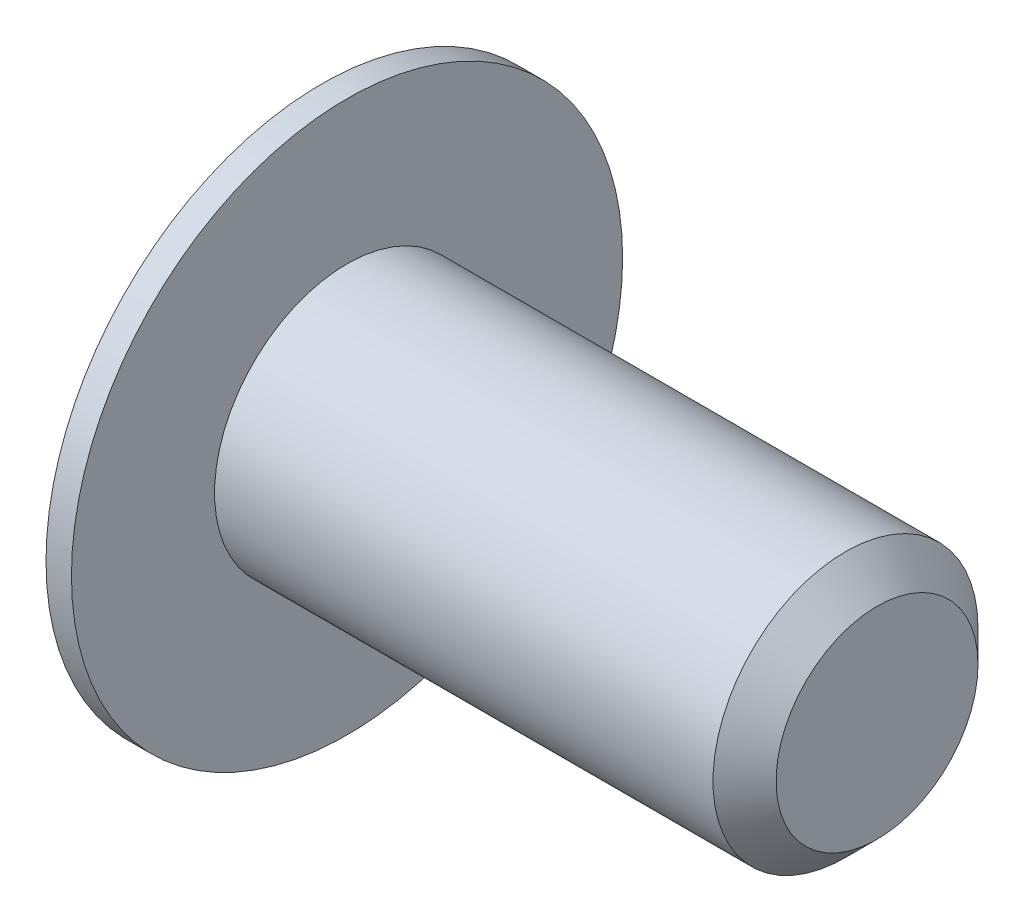
ISO-10303-21;
HEADER;
FILE_DESCRIPTION(('STEP AP214'),'2;1');
FILE_NAME('part.step','',(''),(''),'','','');
FILE_SCHEMA(('AUTOMOTIVE_DESIGN { 1 0 10303 214 1 1 1 1 }'));
ENDSEC;
DATA;
#1=APPLICATION_CONTEXT('core data for automotive mechanical design processes');
#2=APPLICATION_PROTOCOL_DEFINITION('international standard','automotive_design',2000,#1);
#3=PRODUCT_CONTEXT('',#1,'mechanical');
#4=PRODUCT('Part','Part','',(#3));
#5=PRODUCT_RELATED_PRODUCT_CATEGORY('part','',(#4));
#6=PRODUCT_DEFINITION_FORMATION('','',#4);
#7=PRODUCT_DEFINITION_CONTEXT('part definition',#1,'design');
#8=PRODUCT_DEFINITION('design','',#6,#7);
#9=PRODUCT_DEFINITION_SHAPE('','',#8);
#10=(LENGTH_UNIT() NAMED_UNIT(*) SI_UNIT(.MILLI.,.METRE.));
#11=(NAMED_UNIT(*) PLANE_ANGLE_UNIT() SI_UNIT($,.RADIAN.));
#12=(NAMED_UNIT(*) SI_UNIT($,.STERADIAN.) SOLID_ANGLE_UNIT());
#13=UNCERTAINTY_MEASURE_WITH_UNIT(LENGTH_MEASURE(1.E-05),#10,'distance_accuracy_value','');
#14=(GEOMETRIC_REPRESENTATION_CONTEXT(3) GLOBAL_UNCERTAINTY_ASSIGNED_CONTEXT((#13)) GLOBAL_UNIT_ASSIGNED_CONTEXT((#10,
#11,#12)) REPRESENTATION_CONTEXT('',''));
#15=CARTESIAN_POINT('',(0.,0.,0.));
#16=DIRECTION('',(0.,0.,1.));
#17=DIRECTION('',(1.,0.,0.));
#18=AXIS2_PLACEMENT_3D('',#15,#16,#17);
#19=CARTESIAN_POINT('',(0.,0.,0.));
#20=DIRECTION('',(-1.,0.,0.));
#21=DIRECTION('',(0.,0.,1.));
#22=AXIS2_PLACEMENT_3D('',#19,#20,#21);
#23=CYLINDRICAL_SURFACE('',#22,6.604);
#24=CARTESIAN_POINT('',(0.,0.,0.));
#25=DIRECTION('',(-1.,0.,0.));
#26=DIRECTION('',(0.,0.,1.));
#27=AXIS2_PLACEMENT_3D('',#24,#25,#26);
#28=CIRCLE('',#27,6.604);
#29=CARTESIAN_POINT('',(0.,0.,6.604));
#30=VERTEX_POINT('',#29);
#31=EDGE_CURVE('E143',#30,#30,#28,.T.);
#32=ORIENTED_EDGE('',*,*,#31,.T.);
#33=EDGE_LOOP('',(#32));
#34=FACE_BOUND('',#33,.T.);
#35=CARTESIAN_POINT('',(-0.6096,0.,0.));
#36=DIRECTION('',(-1.,0.,0.));
#37=DIRECTION('',(0.,0.,1.));
#38=AXIS2_PLACEMENT_3D('',#35,#36,#37);
#39=CIRCLE('',#38,6.604);
#40=CARTESIAN_POINT('',(-0.6096,0.,6.604));
#41=VERTEX_POINT('',#40);
#42=EDGE_CURVE('E134',#41,#41,#39,.T.);
#43=ORIENTED_EDGE('',*,*,#42,.F.);
#44=EDGE_LOOP('',(#43));
#45=FACE_BOUND('',#44,.T.);
#46=ADVANCED_FACE('F32',(#34,#45),#23,.T.);
#47=CARTESIAN_POINT('',(0.,6.604,0.));
#48=DIRECTION('',(1.,0.,0.));
#49=DIRECTION('',(0.,0.,-1.));
#50=AXIS2_PLACEMENT_3D('',#47,#48,#49);
#51=PLANE('',#50);
#52=CARTESIAN_POINT('',(0.,0.,0.));
#53=DIRECTION('',(1.,0.,0.));
#54=DIRECTION('',(0.,0.,-1.));
#55=AXIS2_PLACEMENT_3D('',#52,#53,#54);
#56=CIRCLE('',#55,3.175);
#57=CARTESIAN_POINT('',(0.,0.,-3.175));
#58=VERTEX_POINT('',#57);
#59=EDGE_CURVE('E140',#58,#58,#56,.T.);
#60=ORIENTED_EDGE('',*,*,#59,.F.);
#61=EDGE_LOOP('',(#60));
#62=FACE_BOUND('',#61,.T.);
#63=ORIENTED_EDGE('',*,*,#31,.F.);
#64=EDGE_LOOP('',(#63));
#65=FACE_BOUND('',#64,.T.);
#66=ADVANCED_FACE('F163',(#62,#65),#51,.T.);
#67=CARTESIAN_POINT('',(-3.048,0.,0.));
#68=DIRECTION('',(-1.,0.,0.));
#69=DIRECTION('',(0.,0.,1.));
#70=AXIS2_PLACEMENT_3D('',#67,#68,#69);
#71=PLANE('',#70);
#72=DIRECTION('',(0.,-0.499999999999994,0.866025403784442));
#73=VECTOR('',#72,1.);
#74=CARTESIAN_POINT('',(-3.048,-1.1731757469933,-2.032));
#75=LINE('',#74,#73);
#76=CARTESIAN_POINT('',(-3.048,-1.1731757469933,-2.032));
#77=VERTEX_POINT('',#76);
#78=CARTESIAN_POINT('',(-3.048,-2.3463514939866,0.));
#79=VERTEX_POINT('',#78);
#80=EDGE_CURVE('E47',#77,#79,#75,.T.);
#81=ORIENTED_EDGE('',*,*,#80,.F.);
#82=DIRECTION('',(0.,-1.,0.));
#83=VECTOR('',#82,1.);
#84=CARTESIAN_POINT('',(-3.048,1.1731757469933,-2.032));
#85=LINE('',#84,#83);
#86=CARTESIAN_POINT('',(-3.048,1.1731757469933,-2.032));
#87=VERTEX_POINT('',#86);
#88=EDGE_CURVE('E130',#87,#77,#85,.T.);
#89=ORIENTED_EDGE('',*,*,#88,.F.);
#90=DIRECTION('',(0.,-0.499999999999994,-0.866025403784442));
#91=VECTOR('',#90,1.);
#92=CARTESIAN_POINT('',(-3.048,2.3463514939866,0.));
#93=LINE('',#92,#91);
#94=CARTESIAN_POINT('',(-3.048,2.3463514939866,0.));
#95=VERTEX_POINT('',#94);
#96=EDGE_CURVE('E128',#95,#87,#93,.T.);
#97=ORIENTED_EDGE('',*,*,#96,.F.);
#98=DIRECTION('',(0.,0.499999999999994,-0.866025403784442));
#99=VECTOR('',#98,1.);
#100=CARTESIAN_POINT('',(-3.048,1.1731757469933,2.032));
#101=LINE('',#100,#99);
#102=CARTESIAN_POINT('',(-3.048,1.1731757469933,2.032));
#103=VERTEX_POINT('',#102);
#104=EDGE_CURVE('E95',#103,#95,#101,.T.);
#105=ORIENTED_EDGE('',*,*,#104,.F.);
#106=DIRECTION('',(0.,1.,0.));
#107=VECTOR('',#106,1.);
#108=CARTESIAN_POINT('',(-3.048,-1.1731757469933,2.032));
#109=LINE('',#108,#107);
#110=CARTESIAN_POINT('',(-3.048,-1.1731757469933,2.032));
#111=VERTEX_POINT('',#110);
#112=EDGE_CURVE('E124',#111,#103,#109,.T.);
#113=ORIENTED_EDGE('',*,*,#112,.F.);
#114=DIRECTION('',(0.,0.499999999999994,0.866025403784442));
#115=VECTOR('',#114,1.);
#116=CARTESIAN_POINT('',(-3.048,-2.3463514939866,0.));
#117=LINE('',#116,#115);
#118=EDGE_CURVE('E121',#79,#111,#117,.T.);
#119=ORIENTED_EDGE('',*,*,#118,.F.);
#120=EDGE_LOOP('',(#81,#89,#97,#105,#113,#119));
#121=FACE_BOUND('',#120,.T.);
#122=CARTESIAN_POINT('',(-3.048,0.,0.));
#123=DIRECTION('',(-1.,0.,0.));
#124=DIRECTION('',(0.,0.,1.));
#125=AXIS2_PLACEMENT_3D('',#122,#123,#124);
#126=CIRCLE('',#125,2.4384);
#127=CARTESIAN_POINT('',(-3.048,0.,2.4384));
#128=VERTEX_POINT('',#127);
#129=EDGE_CURVE('E179',#128,#128,#126,.T.);
#130=ORIENTED_EDGE('',*,*,#129,.T.);
#131=EDGE_LOOP('',(#130));
#132=FACE_BOUND('',#131,.T.);
#133=ADVANCED_FACE('F158',(#121,#132),#71,.T.);
#134=CARTESIAN_POINT('',(-3.048,2.4384,0.));
#135=CARTESIAN_POINT('',(-2.65656917983027,3.80682402530109,0.));
#136=CARTESIAN_POINT('',(-1.75647830409589,5.10070465916927,0.));
#137=CARTESIAN_POINT('',(-0.609600000000002,5.9436,0.));
#138=B_SPLINE_CURVE_WITH_KNOTS('',3,(#134,#135,#136,#137),.UNSPECIFIED.,.F.,.F.,(4,4),(0.,1.),.UNSPECIFIED.);
#139=CARTESIAN_POINT('',(0.,0.,0.));
#140=DIRECTION('',(-1.,0.,0.));
#141=AXIS1_PLACEMENT('',#139,#140);
#142=SURFACE_OF_REVOLUTION('',#138,#141);
#143=CARTESIAN_POINT('',(-0.609600000000002,0.,0.));
#144=DIRECTION('',(-1.,0.,0.));
#145=DIRECTION('',(0.,0.,1.));
#146=AXIS2_PLACEMENT_3D('',#143,#144,#145);
#147=CIRCLE('',#146,5.9436);
#148=CARTESIAN_POINT('',(-0.609600000000002,0.,5.9436));
#149=VERTEX_POINT('',#148);
#150=EDGE_CURVE('E177',#149,#149,#147,.T.);
#151=ORIENTED_EDGE('',*,*,#150,.T.);
#152=EDGE_LOOP('',(#151));
#153=FACE_BOUND('',#152,.T.);
#154=ORIENTED_EDGE('',*,*,#129,.F.);
#155=EDGE_LOOP('',(#154));
#156=FACE_BOUND('',#155,.T.);
#157=ADVANCED_FACE('F153',(#153,#156),#142,.F.);
#158=CARTESIAN_POINT('',(-0.609600000000001,5.9436,0.));
#159=DIRECTION('',(-1.,0.,0.));
#160=DIRECTION('',(0.,0.,1.));
#161=AXIS2_PLACEMENT_3D('',#158,#159,#160);
#162=PLANE('',#161);
#163=ORIENTED_EDGE('',*,*,#42,.T.);
#164=EDGE_LOOP('',(#163));
#165=FACE_BOUND('',#164,.T.);
#166=ORIENTED_EDGE('',*,*,#150,.F.);
#167=EDGE_LOOP('',(#166));
#168=FACE_BOUND('',#167,.T.);
#169=ADVANCED_FACE('F157',(#165,#168),#162,.T.);
#170=CARTESIAN_POINT('',(12.7,0.,0.));
#171=DIRECTION('',(-1.,0.,0.));
#172=DIRECTION('',(0.,0.,1.));
#173=AXIS2_PLACEMENT_3D('',#170,#171,#172);
#174=CYLINDRICAL_SURFACE('',#173,3.175);
#175=CARTESIAN_POINT('',(11.94435,0.,0.));
#176=DIRECTION('',(1.,0.,0.));
#177=DIRECTION('',(0.,0.,-1.));
#178=AXIS2_PLACEMENT_3D('',#175,#176,#177);
#179=CIRCLE('',#178,3.175);
#180=CARTESIAN_POINT('',(11.94435,0.,-3.175));
#181=VERTEX_POINT('',#180);
#182=EDGE_CURVE('E11',#181,#181,#179,.F.);
#183=ORIENTED_EDGE('',*,*,#182,.T.);
#184=EDGE_LOOP('',(#183));
#185=FACE_BOUND('',#184,.T.);
#186=ORIENTED_EDGE('',*,*,#59,.T.);
#187=EDGE_LOOP('',(#186));
#188=FACE_BOUND('',#187,.T.);
#189=ADVANCED_FACE('F198',(#185,#188),#174,.T.);
#190=CARTESIAN_POINT('',(12.7,0.,0.));
#191=DIRECTION('',(1.,0.,0.));
#192=DIRECTION('',(0.,0.,-1.));
#193=AXIS2_PLACEMENT_3D('',#190,#191,#192);
#194=PLANE('',#193);
#195=CARTESIAN_POINT('',(12.7,0.,0.));
#196=DIRECTION('',(1.,0.,0.));
#197=DIRECTION('',(0.,0.,-1.));
#198=AXIS2_PLACEMENT_3D('',#195,#196,#197);
#199=CIRCLE('',#198,2.41935);
#200=CARTESIAN_POINT('',(12.7,0.,-2.41935));
#201=VERTEX_POINT('',#200);
#202=EDGE_CURVE('E40',#201,#201,#199,.T.);
#203=ORIENTED_EDGE('',*,*,#202,.T.);
#204=EDGE_LOOP('',(#203));
#205=FACE_BOUND('',#204,.T.);
#206=ADVANCED_FACE('F187',(#205),#194,.T.);
#207=CARTESIAN_POINT('',(-0.762,-1.1731757469933,-2.032));
#208=DIRECTION('',(0.,-0.866025403784442,-0.499999999999994));
#209=DIRECTION('',(0.,0.499999999999994,-0.866025403784442));
#210=AXIS2_PLACEMENT_3D('',#207,#208,#209);
#211=PLANE('',#210);
#212=ORIENTED_EDGE('',*,*,#80,.T.);
#213=DIRECTION('',(-1.,0.,0.));
#214=VECTOR('',#213,1.);
#215=CARTESIAN_POINT('',(-0.762,-2.3463514939866,0.));
#216=LINE('',#215,#214);
#217=CARTESIAN_POINT('',(-0.762,-2.3463514939866,0.));
#218=VERTEX_POINT('',#217);
#219=EDGE_CURVE('E77',#218,#79,#216,.T.);
#220=ORIENTED_EDGE('',*,*,#219,.F.);
#221=DIRECTION('',(0.,-0.499999999999994,0.866025403784442));
#222=VECTOR('',#221,1.);
#223=CARTESIAN_POINT('',(-0.762,-1.1731757469933,-2.032));
#224=LINE('',#223,#222);
#225=CARTESIAN_POINT('',(-0.762,-1.1731757469933,-2.032));
#226=VERTEX_POINT('',#225);
#227=EDGE_CURVE('E132',#226,#218,#224,.T.);
#228=ORIENTED_EDGE('',*,*,#227,.F.);
#229=DIRECTION('',(-1.,0.,0.));
#230=VECTOR('',#229,1.);
#231=CARTESIAN_POINT('',(-0.762,-1.1731757469933,-2.032));
#232=LINE('',#231,#230);
#233=EDGE_CURVE('E55',#226,#77,#232,.T.);
#234=ORIENTED_EDGE('',*,*,#233,.T.);
#235=EDGE_LOOP('',(#212,#220,#228,#234));
#236=FACE_BOUND('',#235,.T.);
#237=ADVANCED_FACE('F207',(#236),#211,.F.);
#238=CARTESIAN_POINT('',(-0.762,1.1731757469933,-2.032));
#239=DIRECTION('',(0.,0.,-1.));
#240=DIRECTION('',(-1.,0.,0.));
#241=AXIS2_PLACEMENT_3D('',#238,#239,#240);
#242=PLANE('',#241);
#243=ORIENTED_EDGE('',*,*,#88,.T.);
#244=ORIENTED_EDGE('',*,*,#233,.F.);
#245=DIRECTION('',(0.,-1.,0.));
#246=VECTOR('',#245,1.);
#247=CARTESIAN_POINT('',(-0.762,1.1731757469933,-2.032));
#248=LINE('',#247,#246);
#249=CARTESIAN_POINT('',(-0.762,1.1731757469933,-2.032));
#250=VERTEX_POINT('',#249);
#251=EDGE_CURVE('E107',#250,#226,#248,.T.);
#252=ORIENTED_EDGE('',*,*,#251,.F.);
#253=DIRECTION('',(-1.,0.,0.));
#254=VECTOR('',#253,1.);
#255=CARTESIAN_POINT('',(-0.762,1.1731757469933,-2.032));
#256=LINE('',#255,#254);
#257=EDGE_CURVE('E99',#250,#87,#256,.T.);
#258=ORIENTED_EDGE('',*,*,#257,.T.);
#259=EDGE_LOOP('',(#243,#244,#252,#258));
#260=FACE_BOUND('',#259,.T.);
#261=ADVANCED_FACE('F212',(#260),#242,.F.);
#262=CARTESIAN_POINT('',(-0.762,2.3463514939866,0.));
#263=DIRECTION('',(0.,0.866025403784442,-0.499999999999994));
#264=DIRECTION('',(0.,0.499999999999994,0.866025403784442));
#265=AXIS2_PLACEMENT_3D('',#262,#263,#264);
#266=PLANE('',#265);
#267=ORIENTED_EDGE('',*,*,#96,.T.);
#268=ORIENTED_EDGE('',*,*,#257,.F.);
#269=DIRECTION('',(0.,-0.499999999999994,-0.866025403784442));
#270=VECTOR('',#269,1.);
#271=CARTESIAN_POINT('',(-0.762,2.3463514939866,0.));
#272=LINE('',#271,#270);
#273=CARTESIAN_POINT('',(-0.762,2.3463514939866,0.));
#274=VERTEX_POINT('',#273);
#275=EDGE_CURVE('E103',#274,#250,#272,.T.);
#276=ORIENTED_EDGE('',*,*,#275,.F.);
#277=DIRECTION('',(-1.,0.,0.));
#278=VECTOR('',#277,1.);
#279=CARTESIAN_POINT('',(-0.762,2.3463514939866,0.));
#280=LINE('',#279,#278);
#281=EDGE_CURVE('E88',#274,#95,#280,.T.);
#282=ORIENTED_EDGE('',*,*,#281,.T.);
#283=EDGE_LOOP('',(#267,#268,#276,#282));
#284=FACE_BOUND('',#283,.T.);
#285=ADVANCED_FACE('F104',(#284),#266,.F.);
#286=CARTESIAN_POINT('',(-0.762,1.1731757469933,2.032));
#287=DIRECTION('',(0.,0.866025403784442,0.499999999999994));
#288=DIRECTION('',(0.,-0.499999999999994,0.866025403784442));
#289=AXIS2_PLACEMENT_3D('',#286,#287,#288);
#290=PLANE('',#289);
#291=ORIENTED_EDGE('',*,*,#104,.T.);
#292=ORIENTED_EDGE('',*,*,#281,.F.);
#293=DIRECTION('',(0.,0.499999999999994,-0.866025403784442));
#294=VECTOR('',#293,1.);
#295=CARTESIAN_POINT('',(-0.762,1.1731757469933,2.032));
#296=LINE('',#295,#294);
#297=CARTESIAN_POINT('',(-0.762,1.1731757469933,2.032));
#298=VERTEX_POINT('',#297);
#299=EDGE_CURVE('E92',#298,#274,#296,.T.);
#300=ORIENTED_EDGE('',*,*,#299,.F.);
#301=DIRECTION('',(-1.,0.,0.));
#302=VECTOR('',#301,1.);
#303=CARTESIAN_POINT('',(-0.762,1.1731757469933,2.032));
#304=LINE('',#303,#302);
#305=EDGE_CURVE('E100',#298,#103,#304,.T.);
#306=ORIENTED_EDGE('',*,*,#305,.T.);
#307=EDGE_LOOP('',(#291,#292,#300,#306));
#308=FACE_BOUND('',#307,.T.);
#309=ADVANCED_FACE('F90',(#308),#290,.F.);
#310=CARTESIAN_POINT('',(-0.762,-1.1731757469933,2.032));
#311=DIRECTION('',(0.,0.,1.));
#312=DIRECTION('',(1.,0.,0.));
#313=AXIS2_PLACEMENT_3D('',#310,#311,#312);
#314=PLANE('',#313);
#315=ORIENTED_EDGE('',*,*,#112,.T.);
#316=ORIENTED_EDGE('',*,*,#305,.F.);
#317=DIRECTION('',(0.,1.,0.));
#318=VECTOR('',#317,1.);
#319=CARTESIAN_POINT('',(-0.762,-1.1731757469933,2.032));
#320=LINE('',#319,#318);
#321=CARTESIAN_POINT('',(-0.762,-1.1731757469933,2.032));
#322=VERTEX_POINT('',#321);
#323=EDGE_CURVE('E113',#322,#298,#320,.T.);
#324=ORIENTED_EDGE('',*,*,#323,.F.);
#325=DIRECTION('',(-1.,0.,0.));
#326=VECTOR('',#325,1.);
#327=CARTESIAN_POINT('',(-0.762,-1.1731757469933,2.032));
#328=LINE('',#327,#326);
#329=EDGE_CURVE('E137',#322,#111,#328,.T.);
#330=ORIENTED_EDGE('',*,*,#329,.T.);
#331=EDGE_LOOP('',(#315,#316,#324,#330));
#332=FACE_BOUND('',#331,.T.);
#333=ADVANCED_FACE('F215',(#332),#314,.F.);
#334=CARTESIAN_POINT('',(-0.762,-2.3463514939866,0.));
#335=DIRECTION('',(0.,-0.866025403784442,0.499999999999994));
#336=DIRECTION('',(0.,-0.499999999999994,-0.866025403784442));
#337=AXIS2_PLACEMENT_3D('',#334,#335,#336);
#338=PLANE('',#337);
#339=ORIENTED_EDGE('',*,*,#118,.T.);
#340=ORIENTED_EDGE('',*,*,#329,.F.);
#341=DIRECTION('',(0.,0.499999999999994,0.866025403784442));
#342=VECTOR('',#341,1.);
#343=CARTESIAN_POINT('',(-0.762,-2.3463514939866,0.));
#344=LINE('',#343,#342);
#345=EDGE_CURVE('E115',#218,#322,#344,.T.);
#346=ORIENTED_EDGE('',*,*,#345,.F.);
#347=ORIENTED_EDGE('',*,*,#219,.T.);
#348=EDGE_LOOP('',(#339,#340,#346,#347));
#349=FACE_BOUND('',#348,.T.);
#350=ADVANCED_FACE('F194',(#349),#338,.F.);
#351=CARTESIAN_POINT('',(-0.762,0.,0.));
#352=DIRECTION('',(-1.,0.,0.));
#353=DIRECTION('',(0.,0.,1.));
#354=AXIS2_PLACEMENT_3D('',#351,#352,#353);
#355=PLANE('',#354);
#356=ORIENTED_EDGE('',*,*,#227,.T.);
#357=ORIENTED_EDGE('',*,*,#345,.T.);
#358=ORIENTED_EDGE('',*,*,#323,.T.);
#359=ORIENTED_EDGE('',*,*,#299,.T.);
#360=ORIENTED_EDGE('',*,*,#275,.T.);
#361=ORIENTED_EDGE('',*,*,#251,.T.);
#362=EDGE_LOOP('',(#356,#357,#358,#359,#360,#361));
#363=FACE_BOUND('',#362,.T.);
#364=ADVANCED_FACE('F110',(#363),#355,.T.);
#365=CARTESIAN_POINT('',(12.7,0.,0.));
#366=DIRECTION('',(-1.,0.,0.));
#367=DIRECTION('',(0.,0.,1.));
#368=AXIS2_PLACEMENT_3D('',#365,#366,#367);
#369=CONICAL_SURFACE('',#368,2.41935,0.785398163397445);
#370=ORIENTED_EDGE('',*,*,#182,.F.);
#371=EDGE_LOOP('',(#370));
#372=FACE_BOUND('',#371,.T.);
#373=ORIENTED_EDGE('',*,*,#202,.F.);
#374=EDGE_LOOP('',(#373));
#375=FACE_BOUND('',#374,.T.);
#376=ADVANCED_FACE('F34',(#372,#375),#369,.T.);
#377=CLOSED_SHELL('',(#46,#66,#133,#157,#169,#189,#206,#237,#261,#285,#309,#333,#350,#364,#376));
#378=MANIFOLD_SOLID_BREP('B2',#377);
#379=ADVANCED_BREP_SHAPE_REPRESENTATION('',(#18,#378),#14);
#380=SHAPE_DEFINITION_REPRESENTATION(#9,#379);
ENDSEC;
END-ISO-10303-21;
